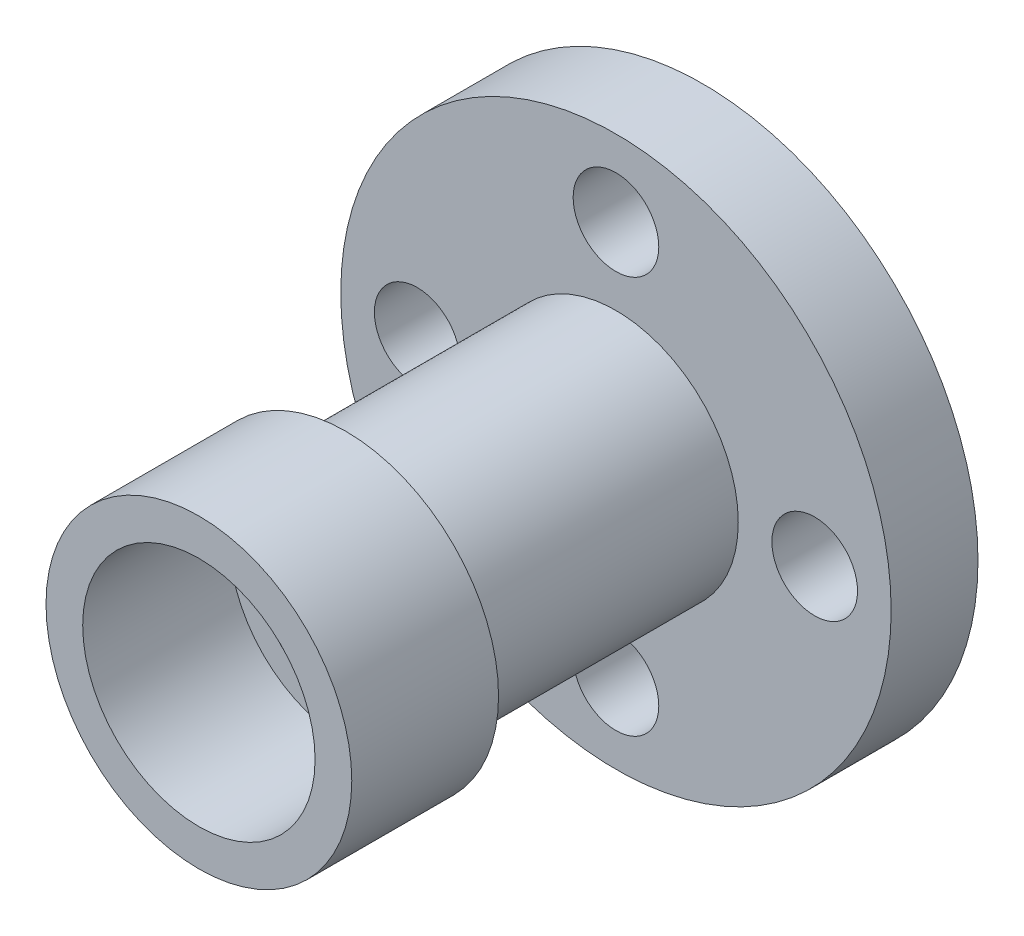
ISO-10303-21;
HEADER;
FILE_DESCRIPTION(('STEP AP214'),'2;1');
FILE_NAME('part.step','',(''),(''),'','','');
FILE_SCHEMA(('AUTOMOTIVE_DESIGN { 1 0 10303 214 1 1 1 1 }'));
ENDSEC;
DATA;
#1=APPLICATION_CONTEXT('core data for automotive mechanical design processes');
#2=APPLICATION_PROTOCOL_DEFINITION('international standard','automotive_design',2000,#1);
#3=PRODUCT_CONTEXT('',#1,'mechanical');
#4=PRODUCT('Part','Part','',(#3));
#5=PRODUCT_RELATED_PRODUCT_CATEGORY('part','',(#4));
#6=PRODUCT_DEFINITION_FORMATION('','',#4);
#7=PRODUCT_DEFINITION_CONTEXT('part definition',#1,'design');
#8=PRODUCT_DEFINITION('design','',#6,#7);
#9=PRODUCT_DEFINITION_SHAPE('','',#8);
#10=(LENGTH_UNIT() NAMED_UNIT(*) SI_UNIT(.MILLI.,.METRE.));
#11=(NAMED_UNIT(*) PLANE_ANGLE_UNIT() SI_UNIT($,.RADIAN.));
#12=(NAMED_UNIT(*) SI_UNIT($,.STERADIAN.) SOLID_ANGLE_UNIT());
#13=UNCERTAINTY_MEASURE_WITH_UNIT(LENGTH_MEASURE(1.E-05),#10,'distance_accuracy_value','');
#14=(GEOMETRIC_REPRESENTATION_CONTEXT(3) GLOBAL_UNCERTAINTY_ASSIGNED_CONTEXT((#13)) GLOBAL_UNIT_ASSIGNED_CONTEXT((#10,
#11,#12)) REPRESENTATION_CONTEXT('',''));
#15=CARTESIAN_POINT('',(0.,0.,0.));
#16=DIRECTION('',(0.,0.,1.));
#17=DIRECTION('',(1.,0.,0.));
#18=AXIS2_PLACEMENT_3D('',#15,#16,#17);
#19=CARTESIAN_POINT('',(0.,0.,14.2));
#20=DIRECTION('',(0.,0.,-1.));
#21=DIRECTION('',(-1.,0.,0.));
#22=AXIS2_PLACEMENT_3D('',#19,#20,#21);
#23=CYLINDRICAL_SURFACE('',#22,45.);
#24=CARTESIAN_POINT('',(0.,0.,14.2));
#25=DIRECTION('',(0.,0.,1.));
#26=DIRECTION('',(1.,0.,0.));
#27=AXIS2_PLACEMENT_3D('',#24,#25,#26);
#28=CIRCLE('',#27,45.);
#29=CARTESIAN_POINT('',(45.,0.,14.2));
#30=VERTEX_POINT('',#29);
#31=EDGE_CURVE('E70',#30,#30,#28,.T.);
#32=ORIENTED_EDGE('',*,*,#31,.F.);
#33=EDGE_LOOP('',(#32));
#34=FACE_BOUND('',#33,.T.);
#35=CARTESIAN_POINT('',(0.,0.,0.));
#36=DIRECTION('',(0.,0.,1.));
#37=DIRECTION('',(1.,0.,0.));
#38=AXIS2_PLACEMENT_3D('',#35,#36,#37);
#39=CIRCLE('',#38,45.);
#40=CARTESIAN_POINT('',(45.,0.,0.));
#41=VERTEX_POINT('',#40);
#42=EDGE_CURVE('E73',#41,#41,#39,.T.);
#43=ORIENTED_EDGE('',*,*,#42,.T.);
#44=EDGE_LOOP('',(#43));
#45=FACE_BOUND('',#44,.T.);
#46=ADVANCED_FACE('F51',(#34,#45),#23,.T.);
#47=CARTESIAN_POINT('',(0.,0.,14.2));
#48=DIRECTION('',(0.,0.,1.));
#49=DIRECTION('',(1.,0.,0.));
#50=AXIS2_PLACEMENT_3D('',#47,#48,#49);
#51=PLANE('',#50);
#52=CARTESIAN_POINT('',(32.5,3.40419430537206E-13,14.2));
#53=DIRECTION('',(0.,0.,1.));
#54=DIRECTION('',(1.,0.,0.));
#55=AXIS2_PLACEMENT_3D('',#52,#53,#54);
#56=CIRCLE('',#55,7.);
#57=CARTESIAN_POINT('',(39.5,3.40419430537206E-13,14.2));
#58=VERTEX_POINT('',#57);
#59=EDGE_CURVE('E104',#58,#58,#56,.T.);
#60=ORIENTED_EDGE('',*,*,#59,.F.);
#61=EDGE_LOOP('',(#60));
#62=FACE_BOUND('',#61,.T.);
#63=CARTESIAN_POINT('',(2.26946287024804E-13,-32.5,14.2));
#64=DIRECTION('',(0.,0.,1.));
#65=DIRECTION('',(1.,0.,0.));
#66=AXIS2_PLACEMENT_3D('',#63,#64,#65);
#67=CIRCLE('',#66,7.);
#68=CARTESIAN_POINT('',(7.00000000000023,-32.5,14.2));
#69=VERTEX_POINT('',#68);
#70=EDGE_CURVE('E108',#69,#69,#67,.T.);
#71=ORIENTED_EDGE('',*,*,#70,.F.);
#72=EDGE_LOOP('',(#71));
#73=FACE_BOUND('',#72,.T.);
#74=CARTESIAN_POINT('',(-32.5,-1.13473143512402E-13,14.2));
#75=DIRECTION('',(0.,0.,1.));
#76=DIRECTION('',(1.,0.,0.));
#77=AXIS2_PLACEMENT_3D('',#74,#75,#76);
#78=CIRCLE('',#77,7.);
#79=CARTESIAN_POINT('',(-25.5,-1.13473143512402E-13,14.2));
#80=VERTEX_POINT('',#79);
#81=EDGE_CURVE('E112',#80,#80,#78,.T.);
#82=ORIENTED_EDGE('',*,*,#81,.F.);
#83=EDGE_LOOP('',(#82));
#84=FACE_BOUND('',#83,.T.);
#85=CARTESIAN_POINT('',(0.,32.5,14.2));
#86=DIRECTION('',(0.,0.,1.));
#87=DIRECTION('',(1.,0.,0.));
#88=AXIS2_PLACEMENT_3D('',#85,#86,#87);
#89=CIRCLE('',#88,7.);
#90=CARTESIAN_POINT('',(7.,32.5,14.2));
#91=VERTEX_POINT('',#90);
#92=EDGE_CURVE('E116',#91,#91,#89,.T.);
#93=ORIENTED_EDGE('',*,*,#92,.F.);
#94=EDGE_LOOP('',(#93));
#95=FACE_BOUND('',#94,.T.);
#96=CARTESIAN_POINT('',(0.,0.,14.2));
#97=DIRECTION('',(0.,0.,1.));
#98=DIRECTION('',(1.,0.,0.));
#99=AXIS2_PLACEMENT_3D('',#96,#97,#98);
#100=CIRCLE('',#99,20.);
#101=CARTESIAN_POINT('',(20.,0.,14.2));
#102=VERTEX_POINT('',#101);
#103=EDGE_CURVE('E77',#102,#102,#100,.F.);
#104=ORIENTED_EDGE('',*,*,#103,.T.);
#105=EDGE_LOOP('',(#104));
#106=FACE_BOUND('',#105,.T.);
#107=ORIENTED_EDGE('',*,*,#31,.T.);
#108=EDGE_LOOP('',(#107));
#109=FACE_BOUND('',#108,.T.);
#110=ADVANCED_FACE('F143',(#62,#73,#84,#95,#106,#109),#51,.T.);
#111=CARTESIAN_POINT('',(0.,0.,0.));
#112=DIRECTION('',(0.,0.,1.));
#113=DIRECTION('',(1.,0.,0.));
#114=AXIS2_PLACEMENT_3D('',#111,#112,#113);
#115=PLANE('',#114);
#116=CARTESIAN_POINT('',(0.,0.,0.));
#117=DIRECTION('',(0.,0.,1.));
#118=DIRECTION('',(1.,0.,0.));
#119=AXIS2_PLACEMENT_3D('',#116,#117,#118);
#120=CIRCLE('',#119,18.);
#121=CARTESIAN_POINT('',(18.,0.,0.));
#122=VERTEX_POINT('',#121);
#123=EDGE_CURVE('E60',#122,#122,#120,.T.);
#124=ORIENTED_EDGE('',*,*,#123,.T.);
#125=EDGE_LOOP('',(#124));
#126=FACE_BOUND('',#125,.T.);
#127=CARTESIAN_POINT('',(32.5,3.40419430537206E-13,0.));
#128=DIRECTION('',(0.,0.,-1.));
#129=DIRECTION('',(-1.,0.,0.));
#130=AXIS2_PLACEMENT_3D('',#127,#128,#129);
#131=CIRCLE('',#130,7.);
#132=CARTESIAN_POINT('',(25.5,3.40419430537206E-13,0.));
#133=VERTEX_POINT('',#132);
#134=EDGE_CURVE('E120',#133,#133,#131,.T.);
#135=ORIENTED_EDGE('',*,*,#134,.F.);
#136=EDGE_LOOP('',(#135));
#137=FACE_BOUND('',#136,.T.);
#138=CARTESIAN_POINT('',(2.26946287024804E-13,-32.5,0.));
#139=DIRECTION('',(0.,0.,-1.));
#140=DIRECTION('',(-1.,0.,0.));
#141=AXIS2_PLACEMENT_3D('',#138,#139,#140);
#142=CIRCLE('',#141,7.);
#143=CARTESIAN_POINT('',(-6.99999999999977,-32.5,0.));
#144=VERTEX_POINT('',#143);
#145=EDGE_CURVE('E129',#144,#144,#142,.T.);
#146=ORIENTED_EDGE('',*,*,#145,.F.);
#147=EDGE_LOOP('',(#146));
#148=FACE_BOUND('',#147,.T.);
#149=CARTESIAN_POINT('',(-32.5,-1.13473143512402E-13,0.));
#150=DIRECTION('',(0.,0.,-1.));
#151=DIRECTION('',(-1.,0.,0.));
#152=AXIS2_PLACEMENT_3D('',#149,#150,#151);
#153=CIRCLE('',#152,7.);
#154=CARTESIAN_POINT('',(-39.5,-1.13473143512402E-13,0.));
#155=VERTEX_POINT('',#154);
#156=EDGE_CURVE('E125',#155,#155,#153,.T.);
#157=ORIENTED_EDGE('',*,*,#156,.F.);
#158=EDGE_LOOP('',(#157));
#159=FACE_BOUND('',#158,.T.);
#160=CARTESIAN_POINT('',(0.,32.5,0.));
#161=DIRECTION('',(0.,0.,-1.));
#162=DIRECTION('',(-1.,0.,0.));
#163=AXIS2_PLACEMENT_3D('',#160,#161,#162);
#164=CIRCLE('',#163,7.);
#165=CARTESIAN_POINT('',(-7.,32.5,0.));
#166=VERTEX_POINT('',#165);
#167=EDGE_CURVE('E121',#166,#166,#164,.T.);
#168=ORIENTED_EDGE('',*,*,#167,.F.);
#169=EDGE_LOOP('',(#168));
#170=FACE_BOUND('',#169,.T.);
#171=ORIENTED_EDGE('',*,*,#42,.F.);
#172=EDGE_LOOP('',(#171));
#173=FACE_BOUND('',#172,.T.);
#174=ADVANCED_FACE('F139',(#126,#137,#148,#159,#170,#173),#115,.F.);
#175=CARTESIAN_POINT('',(0.,0.,58.4));
#176=DIRECTION('',(0.,0.,-1.));
#177=DIRECTION('',(-1.,0.,0.));
#178=AXIS2_PLACEMENT_3D('',#175,#176,#177);
#179=CYLINDRICAL_SURFACE('',#178,20.);
#180=ORIENTED_EDGE('',*,*,#103,.F.);
#181=EDGE_LOOP('',(#180));
#182=FACE_BOUND('',#181,.T.);
#183=CARTESIAN_POINT('',(0.,0.,58.4));
#184=DIRECTION('',(0.,0.,1.));
#185=DIRECTION('',(1.,0.,0.));
#186=AXIS2_PLACEMENT_3D('',#183,#184,#185);
#187=CIRCLE('',#186,20.);
#188=CARTESIAN_POINT('',(20.,0.,58.4));
#189=VERTEX_POINT('',#188);
#190=EDGE_CURVE('E84',#189,#189,#187,.T.);
#191=ORIENTED_EDGE('',*,*,#190,.F.);
#192=EDGE_LOOP('',(#191));
#193=FACE_BOUND('',#192,.T.);
#194=ADVANCED_FACE('F142',(#182,#193),#179,.T.);
#195=CARTESIAN_POINT('',(0.,0.,82.4));
#196=DIRECTION('',(0.,0.,1.));
#197=DIRECTION('',(1.,0.,0.));
#198=AXIS2_PLACEMENT_3D('',#195,#196,#197);
#199=PLANE('',#198);
#200=CARTESIAN_POINT('',(0.,0.,82.4));
#201=DIRECTION('',(0.,0.,1.));
#202=DIRECTION('',(1.,0.,0.));
#203=AXIS2_PLACEMENT_3D('',#200,#201,#202);
#204=CIRCLE('',#203,25.);
#205=CARTESIAN_POINT('',(25.,0.,82.4));
#206=VERTEX_POINT('',#205);
#207=EDGE_CURVE('E88',#206,#206,#204,.T.);
#208=ORIENTED_EDGE('',*,*,#207,.T.);
#209=EDGE_LOOP('',(#208));
#210=FACE_BOUND('',#209,.T.);
#211=CARTESIAN_POINT('',(0.,0.,82.4));
#212=DIRECTION('',(0.,0.,1.));
#213=DIRECTION('',(1.,0.,0.));
#214=AXIS2_PLACEMENT_3D('',#211,#212,#213);
#215=CIRCLE('',#214,19.);
#216=CARTESIAN_POINT('',(19.,0.,82.4));
#217=VERTEX_POINT('',#216);
#218=EDGE_CURVE('E93',#217,#217,#215,.T.);
#219=ORIENTED_EDGE('',*,*,#218,.F.);
#220=EDGE_LOOP('',(#219));
#221=FACE_BOUND('',#220,.T.);
#222=ADVANCED_FACE('F164',(#210,#221),#199,.T.);
#223=CARTESIAN_POINT('',(0.,0.,58.4));
#224=DIRECTION('',(0.,0.,1.));
#225=DIRECTION('',(1.,0.,0.));
#226=AXIS2_PLACEMENT_3D('',#223,#224,#225);
#227=PLANE('',#226);
#228=ORIENTED_EDGE('',*,*,#190,.T.);
#229=EDGE_LOOP('',(#228));
#230=FACE_BOUND('',#229,.T.);
#231=CARTESIAN_POINT('',(0.,0.,58.4));
#232=DIRECTION('',(0.,0.,1.));
#233=DIRECTION('',(1.,0.,0.));
#234=AXIS2_PLACEMENT_3D('',#231,#232,#233);
#235=CIRCLE('',#234,25.);
#236=CARTESIAN_POINT('',(25.,0.,58.4));
#237=VERTEX_POINT('',#236);
#238=EDGE_CURVE('E89',#237,#237,#235,.T.);
#239=ORIENTED_EDGE('',*,*,#238,.F.);
#240=EDGE_LOOP('',(#239));
#241=FACE_BOUND('',#240,.T.);
#242=ADVANCED_FACE('F175',(#230,#241),#227,.F.);
#243=CARTESIAN_POINT('',(0.,0.,82.4));
#244=DIRECTION('',(0.,0.,-1.));
#245=DIRECTION('',(-1.,0.,0.));
#246=AXIS2_PLACEMENT_3D('',#243,#244,#245);
#247=CYLINDRICAL_SURFACE('',#246,25.);
#248=ORIENTED_EDGE('',*,*,#207,.F.);
#249=EDGE_LOOP('',(#248));
#250=FACE_BOUND('',#249,.T.);
#251=ORIENTED_EDGE('',*,*,#238,.T.);
#252=EDGE_LOOP('',(#251));
#253=FACE_BOUND('',#252,.T.);
#254=ADVANCED_FACE('F172',(#250,#253),#247,.T.);
#255=CARTESIAN_POINT('',(0.,0.,82.4));
#256=DIRECTION('',(0.,0.,-1.));
#257=DIRECTION('',(-1.,0.,0.));
#258=AXIS2_PLACEMENT_3D('',#255,#256,#257);
#259=CYLINDRICAL_SURFACE('',#258,19.);
#260=ORIENTED_EDGE('',*,*,#218,.T.);
#261=EDGE_LOOP('',(#260));
#262=FACE_BOUND('',#261,.T.);
#263=CARTESIAN_POINT('',(0.,0.,58.4));
#264=DIRECTION('',(0.,0.,1.));
#265=DIRECTION('',(1.,0.,0.));
#266=AXIS2_PLACEMENT_3D('',#263,#264,#265);
#267=CIRCLE('',#266,19.);
#268=CARTESIAN_POINT('',(19.,0.,58.4));
#269=VERTEX_POINT('',#268);
#270=EDGE_CURVE('E65',#269,#269,#267,.F.);
#271=ORIENTED_EDGE('',*,*,#270,.T.);
#272=EDGE_LOOP('',(#271));
#273=FACE_BOUND('',#272,.T.);
#274=ADVANCED_FACE('F170',(#262,#273),#259,.F.);
#275=CARTESIAN_POINT('',(0.,0.,58.4));
#276=DIRECTION('',(0.,0.,1.));
#277=DIRECTION('',(1.,0.,0.));
#278=AXIS2_PLACEMENT_3D('',#275,#276,#277);
#279=PLANE('',#278);
#280=CARTESIAN_POINT('',(0.,0.,58.4));
#281=DIRECTION('',(0.,0.,1.));
#282=DIRECTION('',(1.,0.,0.));
#283=AXIS2_PLACEMENT_3D('',#280,#281,#282);
#284=CIRCLE('',#283,15.);
#285=CARTESIAN_POINT('',(15.,0.,58.4));
#286=VERTEX_POINT('',#285);
#287=EDGE_CURVE('E100',#286,#286,#284,.T.);
#288=ORIENTED_EDGE('',*,*,#287,.F.);
#289=EDGE_LOOP('',(#288));
#290=FACE_BOUND('',#289,.T.);
#291=ORIENTED_EDGE('',*,*,#270,.F.);
#292=EDGE_LOOP('',(#291));
#293=FACE_BOUND('',#292,.T.);
#294=ADVANCED_FACE('F166',(#290,#293),#279,.T.);
#295=CARTESIAN_POINT('',(0.,0.,-0.600000000000031));
#296=DIRECTION('',(0.,0.,1.));
#297=DIRECTION('',(1.,0.,0.));
#298=AXIS2_PLACEMENT_3D('',#295,#296,#297);
#299=CYLINDRICAL_SURFACE('',#298,15.);
#300=CARTESIAN_POINT('',(0.,0.,3.50000000000005));
#301=DIRECTION('',(0.,0.,1.));
#302=DIRECTION('',(1.,0.,0.));
#303=AXIS2_PLACEMENT_3D('',#300,#301,#302);
#304=CIRCLE('',#303,15.);
#305=CARTESIAN_POINT('',(15.,0.,3.50000000000005));
#306=VERTEX_POINT('',#305);
#307=EDGE_CURVE('E11',#306,#306,#304,.F.);
#308=ORIENTED_EDGE('',*,*,#307,.T.);
#309=EDGE_LOOP('',(#308));
#310=FACE_BOUND('',#309,.T.);
#311=ORIENTED_EDGE('',*,*,#287,.T.);
#312=EDGE_LOOP('',(#311));
#313=FACE_BOUND('',#312,.T.);
#314=ADVANCED_FACE('F169',(#310,#313),#299,.F.);
#315=CARTESIAN_POINT('',(0.,32.5,17.));
#316=DIRECTION('',(0.,0.,-1.));
#317=DIRECTION('',(-1.,0.,0.));
#318=AXIS2_PLACEMENT_3D('',#315,#316,#317);
#319=CYLINDRICAL_SURFACE('',#318,7.);
#320=ORIENTED_EDGE('',*,*,#92,.T.);
#321=EDGE_LOOP('',(#320));
#322=FACE_BOUND('',#321,.T.);
#323=ORIENTED_EDGE('',*,*,#167,.T.);
#324=EDGE_LOOP('',(#323));
#325=FACE_BOUND('',#324,.T.);
#326=ADVANCED_FACE('F188',(#322,#325),#319,.F.);
#327=CARTESIAN_POINT('',(-32.5,-1.13473143512402E-13,17.));
#328=DIRECTION('',(0.,0.,-1.));
#329=DIRECTION('',(-1.,0.,0.));
#330=AXIS2_PLACEMENT_3D('',#327,#328,#329);
#331=CYLINDRICAL_SURFACE('',#330,7.);
#332=ORIENTED_EDGE('',*,*,#81,.T.);
#333=EDGE_LOOP('',(#332));
#334=FACE_BOUND('',#333,.T.);
#335=ORIENTED_EDGE('',*,*,#156,.T.);
#336=EDGE_LOOP('',(#335));
#337=FACE_BOUND('',#336,.T.);
#338=ADVANCED_FACE('F191',(#334,#337),#331,.F.);
#339=CARTESIAN_POINT('',(2.26946287024804E-13,-32.5,17.));
#340=DIRECTION('',(0.,0.,-1.));
#341=DIRECTION('',(-1.,0.,0.));
#342=AXIS2_PLACEMENT_3D('',#339,#340,#341);
#343=CYLINDRICAL_SURFACE('',#342,7.);
#344=ORIENTED_EDGE('',*,*,#70,.T.);
#345=EDGE_LOOP('',(#344));
#346=FACE_BOUND('',#345,.T.);
#347=ORIENTED_EDGE('',*,*,#145,.T.);
#348=EDGE_LOOP('',(#347));
#349=FACE_BOUND('',#348,.T.);
#350=ADVANCED_FACE('F195',(#346,#349),#343,.F.);
#351=CARTESIAN_POINT('',(32.5,3.40419430537206E-13,17.));
#352=DIRECTION('',(0.,0.,-1.));
#353=DIRECTION('',(-1.,0.,0.));
#354=AXIS2_PLACEMENT_3D('',#351,#352,#353);
#355=CYLINDRICAL_SURFACE('',#354,7.);
#356=ORIENTED_EDGE('',*,*,#59,.T.);
#357=EDGE_LOOP('',(#356));
#358=FACE_BOUND('',#357,.T.);
#359=ORIENTED_EDGE('',*,*,#134,.T.);
#360=EDGE_LOOP('',(#359));
#361=FACE_BOUND('',#360,.T.);
#362=ADVANCED_FACE('F137',(#358,#361),#355,.F.);
#363=CARTESIAN_POINT('',(0.,0.,0.));
#364=DIRECTION('',(0.,0.,-1.));
#365=DIRECTION('',(-1.,0.,0.));
#366=AXIS2_PLACEMENT_3D('',#363,#364,#365);
#367=CONICAL_SURFACE('',#366,18.,0.708626272127671);
#368=ORIENTED_EDGE('',*,*,#307,.F.);
#369=EDGE_LOOP('',(#368));
#370=FACE_BOUND('',#369,.T.);
#371=ORIENTED_EDGE('',*,*,#123,.F.);
#372=EDGE_LOOP('',(#371));
#373=FACE_BOUND('',#372,.T.);
#374=ADVANCED_FACE('F54',(#370,#373),#367,.F.);
#375=CLOSED_SHELL('',(#46,#110,#174,#194,#222,#242,#254,#274,#294,#314,#326,#338,#350,#362,#374));
#376=MANIFOLD_SOLID_BREP('B2',#375);
#377=ADVANCED_BREP_SHAPE_REPRESENTATION('',(#18,#376),#14);
#378=SHAPE_DEFINITION_REPRESENTATION(#9,#377);
ENDSEC;
END-ISO-10303-21;
